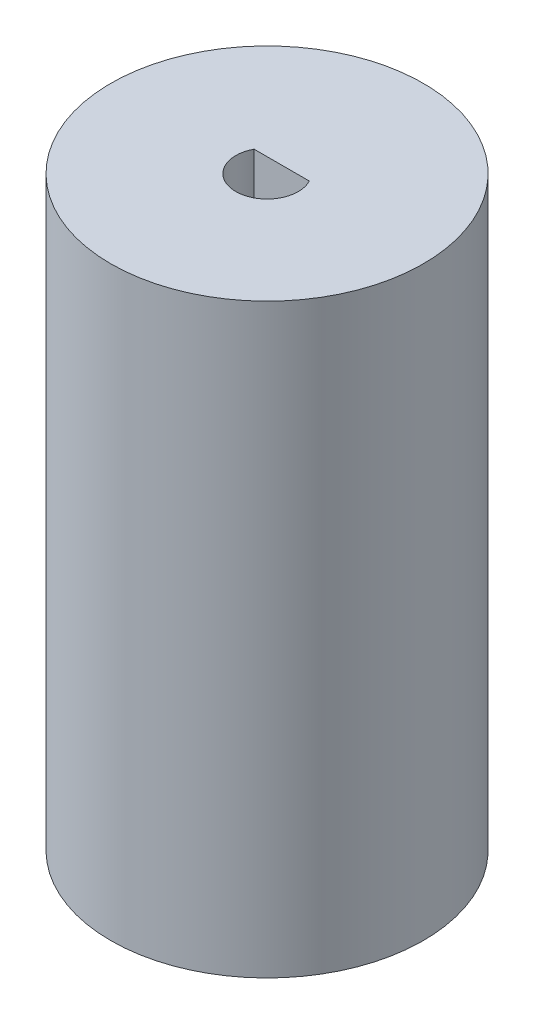
ISO-10303-21;
HEADER;
FILE_DESCRIPTION(('STEP AP214'),'2;1');
FILE_NAME('part.step','',(''),(''),'','','');
FILE_SCHEMA(('AUTOMOTIVE_DESIGN { 1 0 10303 214 1 1 1 1 }'));
ENDSEC;
DATA;
#1=APPLICATION_CONTEXT('core data for automotive mechanical design processes');
#2=APPLICATION_PROTOCOL_DEFINITION('international standard','automotive_design',2000,#1);
#3=PRODUCT_CONTEXT('',#1,'mechanical');
#4=PRODUCT('Part','Part','',(#3));
#5=PRODUCT_RELATED_PRODUCT_CATEGORY('part','',(#4));
#6=PRODUCT_DEFINITION_FORMATION('','',#4);
#7=PRODUCT_DEFINITION_CONTEXT('part definition',#1,'design');
#8=PRODUCT_DEFINITION('design','',#6,#7);
#9=PRODUCT_DEFINITION_SHAPE('','',#8);
#10=(LENGTH_UNIT() NAMED_UNIT(*) SI_UNIT(.MILLI.,.METRE.));
#11=(NAMED_UNIT(*) PLANE_ANGLE_UNIT() SI_UNIT($,.RADIAN.));
#12=(NAMED_UNIT(*) SI_UNIT($,.STERADIAN.) SOLID_ANGLE_UNIT());
#13=UNCERTAINTY_MEASURE_WITH_UNIT(LENGTH_MEASURE(1.E-05),#10,'distance_accuracy_value','');
#14=(GEOMETRIC_REPRESENTATION_CONTEXT(3) GLOBAL_UNCERTAINTY_ASSIGNED_CONTEXT((#13)) GLOBAL_UNIT_ASSIGNED_CONTEXT((#10,
#11,#12)) REPRESENTATION_CONTEXT('',''));
#15=CARTESIAN_POINT('',(0.,0.,0.));
#16=DIRECTION('',(0.,0.,1.));
#17=DIRECTION('',(1.,0.,0.));
#18=AXIS2_PLACEMENT_3D('',#15,#16,#17);
#19=CARTESIAN_POINT('',(0.,30.,-0.75));
#20=DIRECTION('',(0.,0.,-1.));
#21=DIRECTION('',(-1.,0.,0.));
#22=AXIS2_PLACEMENT_3D('',#19,#20,#21);
#23=PLANE('',#22);
#24=DIRECTION('',(1.,0.,0.));
#25=VECTOR('',#24,1.);
#26=CARTESIAN_POINT('',(0.,0.,-0.75));
#27=LINE('',#26,#25);
#28=CARTESIAN_POINT('',(-1.41332940251026,0.,-0.75));
#29=VERTEX_POINT('',#28);
#30=CARTESIAN_POINT('',(1.41332940251026,0.,-0.75));
#31=VERTEX_POINT('',#30);
#32=EDGE_CURVE('E59',#29,#31,#27,.T.);
#33=ORIENTED_EDGE('',*,*,#32,.T.);
#34=DIRECTION('',(0.,-1.,0.));
#35=VECTOR('',#34,1.);
#36=CARTESIAN_POINT('',(1.41332940251026,30.,-0.75));
#37=LINE('',#36,#35);
#38=CARTESIAN_POINT('',(1.41332940251026,30.,-0.75));
#39=VERTEX_POINT('',#38);
#40=EDGE_CURVE('E11',#39,#31,#37,.T.);
#41=ORIENTED_EDGE('',*,*,#40,.F.);
#42=DIRECTION('',(1.,0.,0.));
#43=VECTOR('',#42,1.);
#44=CARTESIAN_POINT('',(0.,30.,-0.75));
#45=LINE('',#44,#43);
#46=CARTESIAN_POINT('',(-1.41332940251026,30.,-0.75));
#47=VERTEX_POINT('',#46);
#48=EDGE_CURVE('E61',#47,#39,#45,.T.);
#49=ORIENTED_EDGE('',*,*,#48,.F.);
#50=DIRECTION('',(0.,-1.,0.));
#51=VECTOR('',#50,1.);
#52=CARTESIAN_POINT('',(-1.41332940251026,30.,-0.75));
#53=LINE('',#52,#51);
#54=EDGE_CURVE('E43',#47,#29,#53,.T.);
#55=ORIENTED_EDGE('',*,*,#54,.T.);
#56=EDGE_LOOP('',(#33,#41,#49,#55));
#57=FACE_BOUND('',#56,.T.);
#58=ADVANCED_FACE('F35',(#57),#23,.F.);
#59=CARTESIAN_POINT('',(0.,30.,0.));
#60=DIRECTION('',(0.,-1.,0.));
#61=DIRECTION('',(0.,0.,-1.));
#62=AXIS2_PLACEMENT_3D('',#59,#60,#61);
#63=CYLINDRICAL_SURFACE('',#62,1.6);
#64=CARTESIAN_POINT('',(0.,0.,0.));
#65=DIRECTION('',(0.,1.,0.));
#66=DIRECTION('',(0.,0.,1.));
#67=AXIS2_PLACEMENT_3D('',#64,#65,#66);
#68=CIRCLE('',#67,1.6);
#69=EDGE_CURVE('E67',#29,#31,#68,.T.);
#70=ORIENTED_EDGE('',*,*,#69,.F.);
#71=ORIENTED_EDGE('',*,*,#54,.F.);
#72=CARTESIAN_POINT('',(0.,30.,0.));
#73=DIRECTION('',(0.,1.,0.));
#74=DIRECTION('',(0.,0.,1.));
#75=AXIS2_PLACEMENT_3D('',#72,#73,#74);
#76=CIRCLE('',#75,1.6);
#77=EDGE_CURVE('E77',#47,#39,#76,.T.);
#78=ORIENTED_EDGE('',*,*,#77,.T.);
#79=ORIENTED_EDGE('',*,*,#40,.T.);
#80=EDGE_LOOP('',(#70,#71,#78,#79));
#81=FACE_BOUND('',#80,.T.);
#82=ADVANCED_FACE('F69',(#81),#63,.F.);
#83=CARTESIAN_POINT('',(0.,30.,0.));
#84=DIRECTION('',(0.,-1.,0.));
#85=DIRECTION('',(0.,0.,-1.));
#86=AXIS2_PLACEMENT_3D('',#83,#84,#85);
#87=CYLINDRICAL_SURFACE('',#86,8.);
#88=CARTESIAN_POINT('',(0.,30.,0.));
#89=DIRECTION('',(0.,1.,0.));
#90=DIRECTION('',(0.,0.,1.));
#91=AXIS2_PLACEMENT_3D('',#88,#89,#90);
#92=CIRCLE('',#91,8.);
#93=CARTESIAN_POINT('',(0.,30.,8.));
#94=VERTEX_POINT('',#93);
#95=EDGE_CURVE('E63',#94,#94,#92,.T.);
#96=ORIENTED_EDGE('',*,*,#95,.F.);
#97=EDGE_LOOP('',(#96));
#98=FACE_BOUND('',#97,.T.);
#99=CARTESIAN_POINT('',(0.,0.,0.));
#100=DIRECTION('',(0.,1.,0.));
#101=DIRECTION('',(0.,0.,1.));
#102=AXIS2_PLACEMENT_3D('',#99,#100,#101);
#103=CIRCLE('',#102,8.);
#104=CARTESIAN_POINT('',(0.,0.,8.));
#105=VERTEX_POINT('',#104);
#106=EDGE_CURVE('E70',#105,#105,#103,.T.);
#107=ORIENTED_EDGE('',*,*,#106,.T.);
#108=EDGE_LOOP('',(#107));
#109=FACE_BOUND('',#108,.T.);
#110=ADVANCED_FACE('F83',(#98,#109),#87,.T.);
#111=CARTESIAN_POINT('',(0.,30.,0.));
#112=DIRECTION('',(0.,1.,0.));
#113=DIRECTION('',(0.,0.,1.));
#114=AXIS2_PLACEMENT_3D('',#111,#112,#113);
#115=PLANE('',#114);
#116=ORIENTED_EDGE('',*,*,#48,.T.);
#117=ORIENTED_EDGE('',*,*,#77,.F.);
#118=EDGE_LOOP('',(#116,#117));
#119=FACE_BOUND('',#118,.T.);
#120=ORIENTED_EDGE('',*,*,#95,.T.);
#121=EDGE_LOOP('',(#120));
#122=FACE_BOUND('',#121,.T.);
#123=ADVANCED_FACE('F80',(#119,#122),#115,.T.);
#124=CARTESIAN_POINT('',(0.,0.,0.));
#125=DIRECTION('',(0.,1.,0.));
#126=DIRECTION('',(0.,0.,1.));
#127=AXIS2_PLACEMENT_3D('',#124,#125,#126);
#128=PLANE('',#127);
#129=ORIENTED_EDGE('',*,*,#32,.F.);
#130=ORIENTED_EDGE('',*,*,#69,.T.);
#131=EDGE_LOOP('',(#129,#130));
#132=FACE_BOUND('',#131,.T.);
#133=ORIENTED_EDGE('',*,*,#106,.F.);
#134=EDGE_LOOP('',(#133));
#135=FACE_BOUND('',#134,.T.);
#136=ADVANCED_FACE('F65',(#132,#135),#128,.F.);
#137=CLOSED_SHELL('',(#58,#82,#110,#123,#136));
#138=MANIFOLD_SOLID_BREP('B2',#137);
#139=ADVANCED_BREP_SHAPE_REPRESENTATION('',(#18,#138),#14);
#140=SHAPE_DEFINITION_REPRESENTATION(#9,#139);
ENDSEC;
END-ISO-10303-21;
